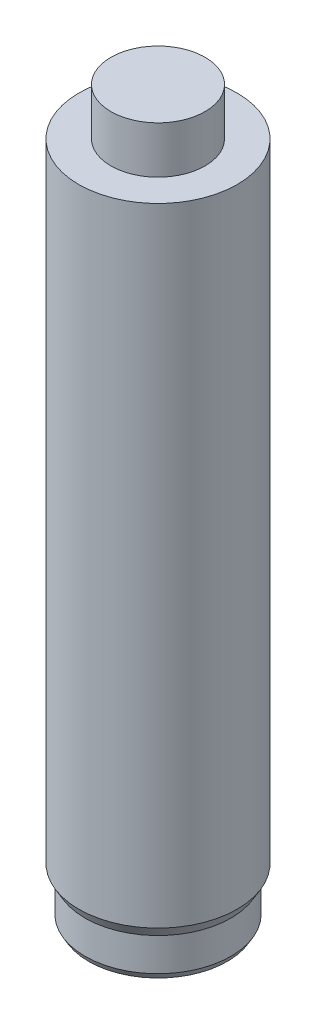
ISO-10303-21;
HEADER;
FILE_DESCRIPTION(('STEP AP214'),'2;1');
FILE_NAME('part.step','',(''),(''),'','','');
FILE_SCHEMA(('AUTOMOTIVE_DESIGN { 1 0 10303 214 1 1 1 1 }'));
ENDSEC;
DATA;
#1=APPLICATION_CONTEXT('core data for automotive mechanical design processes');
#2=APPLICATION_PROTOCOL_DEFINITION('international standard','automotive_design',2000,#1);
#3=PRODUCT_CONTEXT('',#1,'mechanical');
#4=PRODUCT('Part','Part','',(#3));
#5=PRODUCT_RELATED_PRODUCT_CATEGORY('part','',(#4));
#6=PRODUCT_DEFINITION_FORMATION('','',#4);
#7=PRODUCT_DEFINITION_CONTEXT('part definition',#1,'design');
#8=PRODUCT_DEFINITION('design','',#6,#7);
#9=PRODUCT_DEFINITION_SHAPE('','',#8);
#10=(LENGTH_UNIT() NAMED_UNIT(*) SI_UNIT(.MILLI.,.METRE.));
#11=(NAMED_UNIT(*) PLANE_ANGLE_UNIT() SI_UNIT($,.RADIAN.));
#12=(NAMED_UNIT(*) SI_UNIT($,.STERADIAN.) SOLID_ANGLE_UNIT());
#13=UNCERTAINTY_MEASURE_WITH_UNIT(LENGTH_MEASURE(1.E-05),#10,'distance_accuracy_value','');
#14=(GEOMETRIC_REPRESENTATION_CONTEXT(3) GLOBAL_UNCERTAINTY_ASSIGNED_CONTEXT((#13)) GLOBAL_UNIT_ASSIGNED_CONTEXT((#10,
#11,#12)) REPRESENTATION_CONTEXT('',''));
#15=CARTESIAN_POINT('',(0.,0.,0.));
#16=DIRECTION('',(0.,0.,1.));
#17=DIRECTION('',(1.,0.,0.));
#18=AXIS2_PLACEMENT_3D('',#15,#16,#17);
#19=CARTESIAN_POINT('',(0.,0.,0.));
#20=DIRECTION('',(0.,1.,0.));
#21=DIRECTION('',(0.,0.,1.));
#22=AXIS2_PLACEMENT_3D('',#19,#20,#21);
#23=PLANE('',#22);
#24=CARTESIAN_POINT('',(0.,0.,0.));
#25=DIRECTION('',(0.,1.,0.));
#26=DIRECTION('',(0.,0.,1.));
#27=AXIS2_PLACEMENT_3D('',#24,#25,#26);
#28=CIRCLE('',#27,22.0952994616207);
#29=CARTESIAN_POINT('',(0.,0.,22.0952994616207));
#30=VERTEX_POINT('',#29);
#31=EDGE_CURVE('E55',#30,#30,#28,.F.);
#32=ORIENTED_EDGE('',*,*,#31,.T.);
#33=EDGE_LOOP('',(#32));
#34=FACE_BOUND('',#33,.T.);
#35=CARTESIAN_POINT('',(0.,0.,0.));
#36=DIRECTION('',(0.,1.,0.));
#37=DIRECTION('',(0.,0.,1.));
#38=AXIS2_PLACEMENT_3D('',#35,#36,#37);
#39=CIRCLE('',#38,13.45);
#40=CARTESIAN_POINT('',(0.,0.,13.45));
#41=VERTEX_POINT('',#40);
#42=EDGE_CURVE('E75',#41,#41,#39,.T.);
#43=ORIENTED_EDGE('',*,*,#42,.T.);
#44=EDGE_LOOP('',(#43));
#45=FACE_BOUND('',#44,.T.);
#46=ADVANCED_FACE('F46',(#34,#45),#23,.F.);
#47=CARTESIAN_POINT('',(0.,216.,0.));
#48=DIRECTION('',(0.,-1.,0.));
#49=DIRECTION('',(0.,0.,-1.));
#50=AXIS2_PLACEMENT_3D('',#47,#48,#49);
#51=CYLINDRICAL_SURFACE('',#50,25.25);
#52=CARTESIAN_POINT('',(0.,16.,0.));
#53=DIRECTION('',(0.,-1.,0.));
#54=DIRECTION('',(0.,0.,-1.));
#55=AXIS2_PLACEMENT_3D('',#52,#53,#54);
#56=CIRCLE('',#55,25.25);
#57=CARTESIAN_POINT('',(0.,16.,-25.25));
#58=VERTEX_POINT('',#57);
#59=EDGE_CURVE('E65',#58,#58,#56,.F.);
#60=ORIENTED_EDGE('',*,*,#59,.T.);
#61=EDGE_LOOP('',(#60));
#62=FACE_BOUND('',#61,.T.);
#63=CARTESIAN_POINT('',(0.,216.,0.));
#64=DIRECTION('',(0.,1.,0.));
#65=DIRECTION('',(0.,0.,1.));
#66=AXIS2_PLACEMENT_3D('',#63,#64,#65);
#67=CIRCLE('',#66,25.25);
#68=CARTESIAN_POINT('',(0.,216.,25.25));
#69=VERTEX_POINT('',#68);
#70=EDGE_CURVE('E71',#69,#69,#67,.T.);
#71=ORIENTED_EDGE('',*,*,#70,.F.);
#72=EDGE_LOOP('',(#71));
#73=FACE_BOUND('',#72,.T.);
#74=ADVANCED_FACE('F105',(#62,#73),#51,.T.);
#75=CARTESIAN_POINT('',(0.,216.,0.));
#76=DIRECTION('',(0.,1.,0.));
#77=DIRECTION('',(0.,0.,1.));
#78=AXIS2_PLACEMENT_3D('',#75,#76,#77);
#79=PLANE('',#78);
#80=CARTESIAN_POINT('',(0.,216.,0.));
#81=DIRECTION('',(0.,1.,0.));
#82=DIRECTION('',(0.,0.,1.));
#83=AXIS2_PLACEMENT_3D('',#80,#81,#82);
#84=CIRCLE('',#83,15.);
#85=CARTESIAN_POINT('',(0.,216.,15.));
#86=VERTEX_POINT('',#85);
#87=EDGE_CURVE('E84',#86,#86,#84,.T.);
#88=ORIENTED_EDGE('',*,*,#87,.F.);
#89=EDGE_LOOP('',(#88));
#90=FACE_BOUND('',#89,.T.);
#91=ORIENTED_EDGE('',*,*,#70,.T.);
#92=EDGE_LOOP('',(#91));
#93=FACE_BOUND('',#92,.T.);
#94=ADVANCED_FACE('F101',(#90,#93),#79,.T.);
#95=CARTESIAN_POINT('',(0.,216.,0.));
#96=DIRECTION('',(0.,-1.,0.));
#97=DIRECTION('',(0.,0.,-1.));
#98=AXIS2_PLACEMENT_3D('',#95,#96,#97);
#99=CYLINDRICAL_SURFACE('',#98,13.45);
#100=CARTESIAN_POINT('',(0.,216.,0.));
#101=DIRECTION('',(0.,1.,0.));
#102=DIRECTION('',(0.,0.,1.));
#103=AXIS2_PLACEMENT_3D('',#100,#101,#102);
#104=CIRCLE('',#103,13.45);
#105=CARTESIAN_POINT('',(0.,216.,13.45));
#106=VERTEX_POINT('',#105);
#107=EDGE_CURVE('E79',#106,#106,#104,.T.);
#108=ORIENTED_EDGE('',*,*,#107,.T.);
#109=EDGE_LOOP('',(#108));
#110=FACE_BOUND('',#109,.T.);
#111=ORIENTED_EDGE('',*,*,#42,.F.);
#112=EDGE_LOOP('',(#111));
#113=FACE_BOUND('',#112,.T.);
#114=ADVANCED_FACE('F104',(#110,#113),#99,.F.);
#115=CARTESIAN_POINT('',(0.,12.,0.));
#116=DIRECTION('',(0.,-1.,0.));
#117=DIRECTION('',(0.,0.,-1.));
#118=AXIS2_PLACEMENT_3D('',#115,#116,#117);
#119=CYLINDRICAL_SURFACE('',#118,23.25);
#120=CARTESIAN_POINT('',(0.,2.00000000000006,0.));
#121=DIRECTION('',(0.,1.,0.));
#122=DIRECTION('',(0.,0.,1.));
#123=AXIS2_PLACEMENT_3D('',#120,#121,#122);
#124=CIRCLE('',#123,23.25);
#125=CARTESIAN_POINT('',(0.,2.00000000000006,23.25));
#126=VERTEX_POINT('',#125);
#127=EDGE_CURVE('E11',#126,#126,#124,.T.);
#128=ORIENTED_EDGE('',*,*,#127,.T.);
#129=EDGE_LOOP('',(#128));
#130=FACE_BOUND('',#129,.T.);
#131=CARTESIAN_POINT('',(0.,12.5358983848623,0.));
#132=DIRECTION('',(0.,1.,0.));
#133=DIRECTION('',(0.,0.,1.));
#134=AXIS2_PLACEMENT_3D('',#131,#132,#133);
#135=CIRCLE('',#134,23.25);
#136=CARTESIAN_POINT('',(0.,12.5358983848623,23.25));
#137=VERTEX_POINT('',#136);
#138=EDGE_CURVE('E60',#137,#137,#135,.F.);
#139=ORIENTED_EDGE('',*,*,#138,.T.);
#140=EDGE_LOOP('',(#139));
#141=FACE_BOUND('',#140,.T.);
#142=ADVANCED_FACE('F122',(#130,#141),#119,.T.);
#143=CARTESIAN_POINT('',(0.,12.,0.));
#144=DIRECTION('',(0.,1.,0.));
#145=DIRECTION('',(0.,0.,1.));
#146=AXIS2_PLACEMENT_3D('',#143,#144,#145);
#147=CONICAL_SURFACE('',#146,22.9405989232415,0.523598775598307);
#148=ORIENTED_EDGE('',*,*,#59,.F.);
#149=EDGE_LOOP('',(#148));
#150=FACE_BOUND('',#149,.T.);
#151=ORIENTED_EDGE('',*,*,#138,.F.);
#152=EDGE_LOOP('',(#151));
#153=FACE_BOUND('',#152,.T.);
#154=ADVANCED_FACE('F119',(#150,#153),#147,.T.);
#155=CARTESIAN_POINT('',(0.,0.,0.));
#156=DIRECTION('',(0.,1.,0.));
#157=DIRECTION('',(0.,0.,1.));
#158=AXIS2_PLACEMENT_3D('',#155,#156,#157);
#159=CONICAL_SURFACE('',#158,22.0952994616207,0.5235987755983);
#160=ORIENTED_EDGE('',*,*,#127,.F.);
#161=EDGE_LOOP('',(#160));
#162=FACE_BOUND('',#161,.T.);
#163=ORIENTED_EDGE('',*,*,#31,.F.);
#164=EDGE_LOOP('',(#163));
#165=FACE_BOUND('',#164,.T.);
#166=ADVANCED_FACE('F49',(#162,#165),#159,.T.);
#167=CARTESIAN_POINT('',(0.,216.,0.));
#168=DIRECTION('',(0.,1.,0.));
#169=DIRECTION('',(0.,0.,1.));
#170=AXIS2_PLACEMENT_3D('',#167,#168,#169);
#171=PLANE('',#170);
#172=ORIENTED_EDGE('',*,*,#107,.F.);
#173=EDGE_LOOP('',(#172));
#174=FACE_BOUND('',#173,.T.);
#175=ADVANCED_FACE('F97',(#174),#171,.F.);
#176=CARTESIAN_POINT('',(0.,231.,0.));
#177=DIRECTION('',(0.,-1.,0.));
#178=DIRECTION('',(0.,0.,-1.));
#179=AXIS2_PLACEMENT_3D('',#176,#177,#178);
#180=CYLINDRICAL_SURFACE('',#179,15.);
#181=CARTESIAN_POINT('',(0.,231.,0.));
#182=DIRECTION('',(0.,1.,0.));
#183=DIRECTION('',(0.,0.,1.));
#184=AXIS2_PLACEMENT_3D('',#181,#182,#183);
#185=CIRCLE('',#184,15.);
#186=CARTESIAN_POINT('',(0.,231.,15.));
#187=VERTEX_POINT('',#186);
#188=EDGE_CURVE('E83',#187,#187,#185,.T.);
#189=ORIENTED_EDGE('',*,*,#188,.F.);
#190=EDGE_LOOP('',(#189));
#191=FACE_BOUND('',#190,.T.);
#192=ORIENTED_EDGE('',*,*,#87,.T.);
#193=EDGE_LOOP('',(#192));
#194=FACE_BOUND('',#193,.T.);
#195=ADVANCED_FACE('F94',(#191,#194),#180,.T.);
#196=CARTESIAN_POINT('',(0.,231.,0.));
#197=DIRECTION('',(0.,1.,0.));
#198=DIRECTION('',(0.,0.,1.));
#199=AXIS2_PLACEMENT_3D('',#196,#197,#198);
#200=PLANE('',#199);
#201=ORIENTED_EDGE('',*,*,#188,.T.);
#202=EDGE_LOOP('',(#201));
#203=FACE_BOUND('',#202,.T.);
#204=ADVANCED_FACE('F92',(#203),#200,.T.);
#205=CLOSED_SHELL('',(#46,#74,#94,#114,#142,#154,#166,#175,#195,#204));
#206=MANIFOLD_SOLID_BREP('B2',#205);
#207=ADVANCED_BREP_SHAPE_REPRESENTATION('',(#18,#206),#14);
#208=SHAPE_DEFINITION_REPRESENTATION(#9,#207);
ENDSEC;
END-ISO-10303-21;
